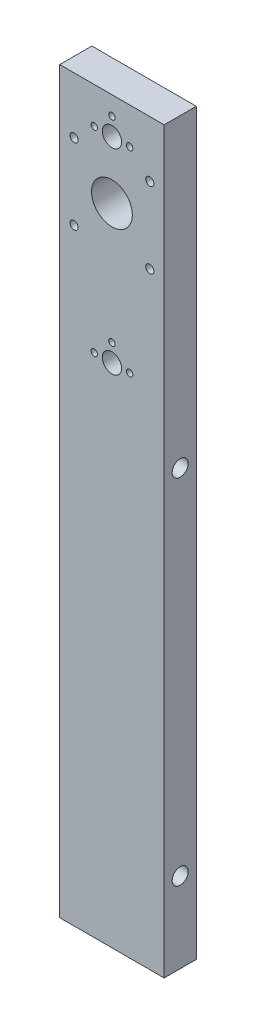
ISO-10303-21;
HEADER;
FILE_DESCRIPTION(('STEP AP214'),'2;1');
FILE_NAME('part.step','',(''),(''),'','','');
FILE_SCHEMA(('AUTOMOTIVE_DESIGN { 1 0 10303 214 1 1 1 1 }'));
ENDSEC;
DATA;
#1=APPLICATION_CONTEXT('core data for automotive mechanical design processes');
#2=APPLICATION_PROTOCOL_DEFINITION('international standard','automotive_design',2000,#1);
#3=PRODUCT_CONTEXT('',#1,'mechanical');
#4=PRODUCT('Part','Part','',(#3));
#5=PRODUCT_RELATED_PRODUCT_CATEGORY('part','',(#4));
#6=PRODUCT_DEFINITION_FORMATION('','',#4);
#7=PRODUCT_DEFINITION_CONTEXT('part definition',#1,'design');
#8=PRODUCT_DEFINITION('design','',#6,#7);
#9=PRODUCT_DEFINITION_SHAPE('','',#8);
#10=(LENGTH_UNIT() NAMED_UNIT(*) SI_UNIT(.MILLI.,.METRE.));
#11=(NAMED_UNIT(*) PLANE_ANGLE_UNIT() SI_UNIT($,.RADIAN.));
#12=(NAMED_UNIT(*) SI_UNIT($,.STERADIAN.) SOLID_ANGLE_UNIT());
#13=UNCERTAINTY_MEASURE_WITH_UNIT(LENGTH_MEASURE(1.E-05),#10,'distance_accuracy_value','');
#14=(GEOMETRIC_REPRESENTATION_CONTEXT(3) GLOBAL_UNCERTAINTY_ASSIGNED_CONTEXT((#13)) GLOBAL_UNIT_ASSIGNED_CONTEXT((#10,
#11,#12)) REPRESENTATION_CONTEXT('',''));
#15=CARTESIAN_POINT('',(0.,0.,0.));
#16=DIRECTION('',(0.,0.,1.));
#17=DIRECTION('',(1.,0.,0.));
#18=AXIS2_PLACEMENT_3D('',#15,#16,#17);
#19=CARTESIAN_POINT('',(-32.5,38.575,20.));
#20=DIRECTION('',(0.,0.,-1.));
#21=DIRECTION('',(-1.,0.,0.));
#22=AXIS2_PLACEMENT_3D('',#19,#20,#21);
#23=PLANE('',#22);
#24=CARTESIAN_POINT('',(-4.25960723338862E-13,27.,20.));
#25=DIRECTION('',(0.,0.,1.));
#26=DIRECTION('',(1.,0.,0.));
#27=AXIS2_PLACEMENT_3D('',#24,#25,#26);
#28=CIRCLE('',#27,2.);
#29=CARTESIAN_POINT('',(1.99999999999957,27.,20.));
#30=VERTEX_POINT('',#29);
#31=EDGE_CURVE('E129',#30,#30,#28,.T.);
#32=ORIENTED_EDGE('',*,*,#31,.F.);
#33=EDGE_LOOP('',(#32));
#34=FACE_BOUND('',#33,.T.);
#35=CARTESIAN_POINT('',(-11.,-106.,20.));
#36=DIRECTION('',(0.,0.,1.));
#37=DIRECTION('',(1.,0.,0.));
#38=AXIS2_PLACEMENT_3D('',#35,#36,#37);
#39=CIRCLE('',#38,2.);
#40=CARTESIAN_POINT('',(-9.,-106.,20.));
#41=VERTEX_POINT('',#40);
#42=EDGE_CURVE('E141',#41,#41,#39,.T.);
#43=ORIENTED_EDGE('',*,*,#42,.F.);
#44=EDGE_LOOP('',(#43));
#45=FACE_BOUND('',#44,.T.);
#46=CARTESIAN_POINT('',(-4.25960723338862E-13,16.,20.));
#47=DIRECTION('',(0.,0.,1.));
#48=DIRECTION('',(1.,0.,0.));
#49=AXIS2_PLACEMENT_3D('',#46,#47,#48);
#50=CIRCLE('',#49,6.);
#51=CARTESIAN_POINT('',(5.99999999999958,16.,20.));
#52=VERTEX_POINT('',#51);
#53=EDGE_CURVE('E153',#52,#52,#50,.T.);
#54=ORIENTED_EDGE('',*,*,#53,.F.);
#55=EDGE_LOOP('',(#54));
#56=FACE_BOUND('',#55,.T.);
#57=CARTESIAN_POINT('',(0.,-106.,20.));
#58=DIRECTION('',(0.,0.,1.));
#59=DIRECTION('',(1.,0.,0.));
#60=AXIS2_PLACEMENT_3D('',#57,#58,#59);
#61=CIRCLE('',#60,6.);
#62=CARTESIAN_POINT('',(6.,-106.,20.));
#63=VERTEX_POINT('',#62);
#64=EDGE_CURVE('E165',#63,#63,#61,.T.);
#65=ORIENTED_EDGE('',*,*,#64,.F.);
#66=EDGE_LOOP('',(#65));
#67=FACE_BOUND('',#66,.T.);
#68=CARTESIAN_POINT('',(-23.5712,-43.5712,20.));
#69=DIRECTION('',(0.,0.,1.));
#70=DIRECTION('',(1.,0.,0.));
#71=AXIS2_PLACEMENT_3D('',#68,#69,#70);
#72=CIRCLE('',#71,2.54);
#73=CARTESIAN_POINT('',(-21.0312,-43.5712,20.));
#74=VERTEX_POINT('',#73);
#75=EDGE_CURVE('E177',#74,#74,#72,.T.);
#76=ORIENTED_EDGE('',*,*,#75,.F.);
#77=EDGE_LOOP('',(#76));
#78=FACE_BOUND('',#77,.T.);
#79=CARTESIAN_POINT('',(23.5712,3.57119999999999,20.));
#80=DIRECTION('',(0.,0.,1.));
#81=DIRECTION('',(1.,0.,0.));
#82=AXIS2_PLACEMENT_3D('',#79,#80,#81);
#83=CIRCLE('',#82,2.54);
#84=CARTESIAN_POINT('',(26.1112,3.57119999999999,20.));
#85=VERTEX_POINT('',#84);
#86=EDGE_CURVE('E189',#85,#85,#83,.T.);
#87=ORIENTED_EDGE('',*,*,#86,.F.);
#88=EDGE_LOOP('',(#87));
#89=FACE_BOUND('',#88,.T.);
#90=DIRECTION('',(0.,-1.,0.));
#91=VECTOR('',#90,1.);
#92=CARTESIAN_POINT('',(-32.5,-421.425,20.));
#93=LINE('',#92,#91);
#94=CARTESIAN_POINT('',(-32.5,38.575,20.));
#95=VERTEX_POINT('',#94);
#96=CARTESIAN_POINT('',(-32.5,-421.425,20.));
#97=VERTEX_POINT('',#96);
#98=EDGE_CURVE('E87',#95,#97,#93,.T.);
#99=ORIENTED_EDGE('',*,*,#98,.T.);
#100=DIRECTION('',(1.,0.,0.));
#101=VECTOR('',#100,1.);
#102=CARTESIAN_POINT('',(-32.5,-421.425,20.));
#103=LINE('',#102,#101);
#104=CARTESIAN_POINT('',(32.5,-421.425,20.));
#105=VERTEX_POINT('',#104);
#106=EDGE_CURVE('E82',#97,#105,#103,.T.);
#107=ORIENTED_EDGE('',*,*,#106,.T.);
#108=DIRECTION('',(0.,1.,0.));
#109=VECTOR('',#108,1.);
#110=CARTESIAN_POINT('',(32.5,-421.425,20.));
#111=LINE('',#110,#109);
#112=CARTESIAN_POINT('',(32.5,38.575,20.));
#113=VERTEX_POINT('',#112);
#114=EDGE_CURVE('E85',#105,#113,#111,.T.);
#115=ORIENTED_EDGE('',*,*,#114,.T.);
#116=DIRECTION('',(-1.,0.,0.));
#117=VECTOR('',#116,1.);
#118=CARTESIAN_POINT('',(-32.5,38.575,20.));
#119=LINE('',#118,#117);
#120=EDGE_CURVE('E52',#113,#95,#119,.T.);
#121=ORIENTED_EDGE('',*,*,#120,.T.);
#122=EDGE_LOOP('',(#99,#107,#115,#121));
#123=FACE_BOUND('',#122,.T.);
#124=CARTESIAN_POINT('',(-23.5712,3.57119999999998,20.));
#125=DIRECTION('',(0.,0.,1.));
#126=DIRECTION('',(1.,0.,0.));
#127=AXIS2_PLACEMENT_3D('',#124,#125,#126);
#128=CIRCLE('',#127,2.54);
#129=CARTESIAN_POINT('',(-21.0312,3.57119999999998,20.));
#130=VERTEX_POINT('',#129);
#131=EDGE_CURVE('E103',#130,#130,#128,.T.);
#132=ORIENTED_EDGE('',*,*,#131,.F.);
#133=EDGE_LOOP('',(#132));
#134=FACE_BOUND('',#133,.T.);
#135=CARTESIAN_POINT('',(23.5712,-43.5712,20.));
#136=DIRECTION('',(0.,0.,1.));
#137=DIRECTION('',(1.,0.,0.));
#138=AXIS2_PLACEMENT_3D('',#135,#136,#137);
#139=CIRCLE('',#138,2.54);
#140=CARTESIAN_POINT('',(26.1112,-43.5712,20.));
#141=VERTEX_POINT('',#140);
#142=EDGE_CURVE('E183',#141,#141,#139,.T.);
#143=ORIENTED_EDGE('',*,*,#142,.F.);
#144=EDGE_LOOP('',(#143));
#145=FACE_BOUND('',#144,.T.);
#146=CARTESIAN_POINT('',(0.,-20.,20.));
#147=DIRECTION('',(0.,0.,1.));
#148=DIRECTION('',(1.,0.,0.));
#149=AXIS2_PLACEMENT_3D('',#146,#147,#148);
#150=CIRCLE('',#149,12.7);
#151=CARTESIAN_POINT('',(12.7,-20.,20.));
#152=VERTEX_POINT('',#151);
#153=EDGE_CURVE('E171',#152,#152,#150,.T.);
#154=ORIENTED_EDGE('',*,*,#153,.F.);
#155=EDGE_LOOP('',(#154));
#156=FACE_BOUND('',#155,.T.);
#157=CARTESIAN_POINT('',(11.,-106.,20.));
#158=DIRECTION('',(0.,0.,1.));
#159=DIRECTION('',(1.,0.,0.));
#160=AXIS2_PLACEMENT_3D('',#157,#158,#159);
#161=CIRCLE('',#160,2.);
#162=CARTESIAN_POINT('',(13.,-106.,20.));
#163=VERTEX_POINT('',#162);
#164=EDGE_CURVE('E159',#163,#163,#161,.T.);
#165=ORIENTED_EDGE('',*,*,#164,.F.);
#166=EDGE_LOOP('',(#165));
#167=FACE_BOUND('',#166,.T.);
#168=CARTESIAN_POINT('',(0.,-95.,20.));
#169=DIRECTION('',(0.,0.,1.));
#170=DIRECTION('',(1.,0.,0.));
#171=AXIS2_PLACEMENT_3D('',#168,#169,#170);
#172=CIRCLE('',#171,2.);
#173=CARTESIAN_POINT('',(2.,-95.,20.));
#174=VERTEX_POINT('',#173);
#175=EDGE_CURVE('E147',#174,#174,#172,.T.);
#176=ORIENTED_EDGE('',*,*,#175,.F.);
#177=EDGE_LOOP('',(#176));
#178=FACE_BOUND('',#177,.T.);
#179=CARTESIAN_POINT('',(10.9999999999996,16.,20.));
#180=DIRECTION('',(0.,0.,1.));
#181=DIRECTION('',(1.,0.,0.));
#182=AXIS2_PLACEMENT_3D('',#179,#180,#181);
#183=CIRCLE('',#182,2.);
#184=CARTESIAN_POINT('',(12.9999999999996,16.,20.));
#185=VERTEX_POINT('',#184);
#186=EDGE_CURVE('E135',#185,#185,#183,.T.);
#187=ORIENTED_EDGE('',*,*,#186,.F.);
#188=EDGE_LOOP('',(#187));
#189=FACE_BOUND('',#188,.T.);
#190=CARTESIAN_POINT('',(-11.0000000000004,16.,20.));
#191=DIRECTION('',(0.,0.,1.));
#192=DIRECTION('',(1.,0.,0.));
#193=AXIS2_PLACEMENT_3D('',#190,#191,#192);
#194=CIRCLE('',#193,2.);
#195=CARTESIAN_POINT('',(-9.00000000000042,16.,20.));
#196=VERTEX_POINT('',#195);
#197=EDGE_CURVE('E123',#196,#196,#194,.T.);
#198=ORIENTED_EDGE('',*,*,#197,.F.);
#199=EDGE_LOOP('',(#198));
#200=FACE_BOUND('',#199,.T.);
#201=ADVANCED_FACE('F33',(#34,#45,#56,#67,#78,#89,#123,#134,#145,#156,#167,#178,#189,#200),#23,.F.);
#202=CARTESIAN_POINT('',(-32.5,38.575,0.));
#203=DIRECTION('',(0.,0.,-1.));
#204=DIRECTION('',(-1.,0.,0.));
#205=AXIS2_PLACEMENT_3D('',#202,#203,#204);
#206=PLANE('',#205);
#207=CARTESIAN_POINT('',(-4.25960723338862E-13,27.,0.));
#208=DIRECTION('',(0.,0.,1.));
#209=DIRECTION('',(1.,0.,0.));
#210=AXIS2_PLACEMENT_3D('',#207,#208,#209);
#211=CIRCLE('',#210,2.);
#212=CARTESIAN_POINT('',(1.99999999999957,27.,0.));
#213=VERTEX_POINT('',#212);
#214=EDGE_CURVE('E126',#213,#213,#211,.T.);
#215=ORIENTED_EDGE('',*,*,#214,.T.);
#216=EDGE_LOOP('',(#215));
#217=FACE_BOUND('',#216,.T.);
#218=CARTESIAN_POINT('',(-11.,-106.,0.));
#219=DIRECTION('',(0.,0.,1.));
#220=DIRECTION('',(1.,0.,0.));
#221=AXIS2_PLACEMENT_3D('',#218,#219,#220);
#222=CIRCLE('',#221,2.);
#223=CARTESIAN_POINT('',(-9.,-106.,0.));
#224=VERTEX_POINT('',#223);
#225=EDGE_CURVE('E138',#224,#224,#222,.T.);
#226=ORIENTED_EDGE('',*,*,#225,.T.);
#227=EDGE_LOOP('',(#226));
#228=FACE_BOUND('',#227,.T.);
#229=CARTESIAN_POINT('',(-4.25960723338862E-13,16.,0.));
#230=DIRECTION('',(0.,0.,1.));
#231=DIRECTION('',(1.,0.,0.));
#232=AXIS2_PLACEMENT_3D('',#229,#230,#231);
#233=CIRCLE('',#232,6.);
#234=CARTESIAN_POINT('',(5.99999999999958,16.,0.));
#235=VERTEX_POINT('',#234);
#236=EDGE_CURVE('E150',#235,#235,#233,.T.);
#237=ORIENTED_EDGE('',*,*,#236,.T.);
#238=EDGE_LOOP('',(#237));
#239=FACE_BOUND('',#238,.T.);
#240=CARTESIAN_POINT('',(0.,-106.,0.));
#241=DIRECTION('',(0.,0.,1.));
#242=DIRECTION('',(1.,0.,0.));
#243=AXIS2_PLACEMENT_3D('',#240,#241,#242);
#244=CIRCLE('',#243,6.);
#245=CARTESIAN_POINT('',(6.,-106.,0.));
#246=VERTEX_POINT('',#245);
#247=EDGE_CURVE('E162',#246,#246,#244,.T.);
#248=ORIENTED_EDGE('',*,*,#247,.T.);
#249=EDGE_LOOP('',(#248));
#250=FACE_BOUND('',#249,.T.);
#251=CARTESIAN_POINT('',(-23.5712,-43.5712,0.));
#252=DIRECTION('',(0.,0.,1.));
#253=DIRECTION('',(1.,0.,0.));
#254=AXIS2_PLACEMENT_3D('',#251,#252,#253);
#255=CIRCLE('',#254,2.54);
#256=CARTESIAN_POINT('',(-21.0312,-43.5712,0.));
#257=VERTEX_POINT('',#256);
#258=EDGE_CURVE('E174',#257,#257,#255,.T.);
#259=ORIENTED_EDGE('',*,*,#258,.T.);
#260=EDGE_LOOP('',(#259));
#261=FACE_BOUND('',#260,.T.);
#262=CARTESIAN_POINT('',(23.5712,3.57119999999999,0.));
#263=DIRECTION('',(0.,0.,1.));
#264=DIRECTION('',(1.,0.,0.));
#265=AXIS2_PLACEMENT_3D('',#262,#263,#264);
#266=CIRCLE('',#265,2.54);
#267=CARTESIAN_POINT('',(26.1112,3.57119999999999,0.));
#268=VERTEX_POINT('',#267);
#269=EDGE_CURVE('E186',#268,#268,#266,.T.);
#270=ORIENTED_EDGE('',*,*,#269,.T.);
#271=EDGE_LOOP('',(#270));
#272=FACE_BOUND('',#271,.T.);
#273=DIRECTION('',(0.,-1.,0.));
#274=VECTOR('',#273,1.);
#275=CARTESIAN_POINT('',(-32.5,-421.425,0.));
#276=LINE('',#275,#274);
#277=CARTESIAN_POINT('',(-32.5,38.575,0.));
#278=VERTEX_POINT('',#277);
#279=CARTESIAN_POINT('',(-32.5,-421.425,0.));
#280=VERTEX_POINT('',#279);
#281=EDGE_CURVE('E100',#278,#280,#276,.T.);
#282=ORIENTED_EDGE('',*,*,#281,.F.);
#283=DIRECTION('',(-1.,0.,0.));
#284=VECTOR('',#283,1.);
#285=CARTESIAN_POINT('',(-32.5,38.575,0.));
#286=LINE('',#285,#284);
#287=CARTESIAN_POINT('',(32.5,38.575,0.));
#288=VERTEX_POINT('',#287);
#289=EDGE_CURVE('E75',#288,#278,#286,.T.);
#290=ORIENTED_EDGE('',*,*,#289,.F.);
#291=DIRECTION('',(0.,1.,0.));
#292=VECTOR('',#291,1.);
#293=CARTESIAN_POINT('',(32.5,-421.425,0.));
#294=LINE('',#293,#292);
#295=CARTESIAN_POINT('',(32.5,-421.425,0.));
#296=VERTEX_POINT('',#295);
#297=EDGE_CURVE('E69',#296,#288,#294,.T.);
#298=ORIENTED_EDGE('',*,*,#297,.F.);
#299=DIRECTION('',(1.,0.,0.));
#300=VECTOR('',#299,1.);
#301=CARTESIAN_POINT('',(-32.5,-421.425,0.));
#302=LINE('',#301,#300);
#303=EDGE_CURVE('E91',#280,#296,#302,.T.);
#304=ORIENTED_EDGE('',*,*,#303,.F.);
#305=EDGE_LOOP('',(#282,#290,#298,#304));
#306=FACE_BOUND('',#305,.T.);
#307=CARTESIAN_POINT('',(-23.5712,3.57119999999998,0.));
#308=DIRECTION('',(0.,0.,1.));
#309=DIRECTION('',(1.,0.,0.));
#310=AXIS2_PLACEMENT_3D('',#307,#308,#309);
#311=CIRCLE('',#310,2.54);
#312=CARTESIAN_POINT('',(-21.0312,3.57119999999998,0.));
#313=VERTEX_POINT('',#312);
#314=EDGE_CURVE('E192',#313,#313,#311,.T.);
#315=ORIENTED_EDGE('',*,*,#314,.T.);
#316=EDGE_LOOP('',(#315));
#317=FACE_BOUND('',#316,.T.);
#318=CARTESIAN_POINT('',(23.5712,-43.5712,0.));
#319=DIRECTION('',(0.,0.,1.));
#320=DIRECTION('',(1.,0.,0.));
#321=AXIS2_PLACEMENT_3D('',#318,#319,#320);
#322=CIRCLE('',#321,2.54);
#323=CARTESIAN_POINT('',(26.1112,-43.5712,0.));
#324=VERTEX_POINT('',#323);
#325=EDGE_CURVE('E180',#324,#324,#322,.T.);
#326=ORIENTED_EDGE('',*,*,#325,.T.);
#327=EDGE_LOOP('',(#326));
#328=FACE_BOUND('',#327,.T.);
#329=CARTESIAN_POINT('',(0.,-20.,0.));
#330=DIRECTION('',(0.,0.,1.));
#331=DIRECTION('',(1.,0.,0.));
#332=AXIS2_PLACEMENT_3D('',#329,#330,#331);
#333=CIRCLE('',#332,12.7);
#334=CARTESIAN_POINT('',(12.7,-20.,0.));
#335=VERTEX_POINT('',#334);
#336=EDGE_CURVE('E168',#335,#335,#333,.T.);
#337=ORIENTED_EDGE('',*,*,#336,.T.);
#338=EDGE_LOOP('',(#337));
#339=FACE_BOUND('',#338,.T.);
#340=CARTESIAN_POINT('',(11.,-106.,0.));
#341=DIRECTION('',(0.,0.,1.));
#342=DIRECTION('',(1.,0.,0.));
#343=AXIS2_PLACEMENT_3D('',#340,#341,#342);
#344=CIRCLE('',#343,2.);
#345=CARTESIAN_POINT('',(13.,-106.,0.));
#346=VERTEX_POINT('',#345);
#347=EDGE_CURVE('E156',#346,#346,#344,.T.);
#348=ORIENTED_EDGE('',*,*,#347,.T.);
#349=EDGE_LOOP('',(#348));
#350=FACE_BOUND('',#349,.T.);
#351=CARTESIAN_POINT('',(0.,-95.,0.));
#352=DIRECTION('',(0.,0.,1.));
#353=DIRECTION('',(1.,0.,0.));
#354=AXIS2_PLACEMENT_3D('',#351,#352,#353);
#355=CIRCLE('',#354,2.);
#356=CARTESIAN_POINT('',(2.,-95.,0.));
#357=VERTEX_POINT('',#356);
#358=EDGE_CURVE('E144',#357,#357,#355,.T.);
#359=ORIENTED_EDGE('',*,*,#358,.T.);
#360=EDGE_LOOP('',(#359));
#361=FACE_BOUND('',#360,.T.);
#362=CARTESIAN_POINT('',(10.9999999999996,16.,0.));
#363=DIRECTION('',(0.,0.,1.));
#364=DIRECTION('',(1.,0.,0.));
#365=AXIS2_PLACEMENT_3D('',#362,#363,#364);
#366=CIRCLE('',#365,2.);
#367=CARTESIAN_POINT('',(12.9999999999996,16.,0.));
#368=VERTEX_POINT('',#367);
#369=EDGE_CURVE('E132',#368,#368,#366,.T.);
#370=ORIENTED_EDGE('',*,*,#369,.T.);
#371=EDGE_LOOP('',(#370));
#372=FACE_BOUND('',#371,.T.);
#373=CARTESIAN_POINT('',(-11.0000000000004,16.,0.));
#374=DIRECTION('',(0.,0.,1.));
#375=DIRECTION('',(1.,0.,0.));
#376=AXIS2_PLACEMENT_3D('',#373,#374,#375);
#377=CIRCLE('',#376,2.);
#378=CARTESIAN_POINT('',(-9.00000000000042,16.,0.));
#379=VERTEX_POINT('',#378);
#380=EDGE_CURVE('E115',#379,#379,#377,.T.);
#381=ORIENTED_EDGE('',*,*,#380,.T.);
#382=EDGE_LOOP('',(#381));
#383=FACE_BOUND('',#382,.T.);
#384=ADVANCED_FACE('F200',(#217,#228,#239,#250,#261,#272,#306,#317,#328,#339,#350,#361,#372,
#383),#206,.T.);
#385=CARTESIAN_POINT('',(-32.5,-421.425,20.));
#386=DIRECTION('',(1.,0.,0.));
#387=DIRECTION('',(0.,1.,0.));
#388=AXIS2_PLACEMENT_3D('',#385,#386,#387);
#389=PLANE('',#388);
#390=CARTESIAN_POINT('',(-32.5,-151.425,10.));
#391=DIRECTION('',(1.,0.,0.));
#392=DIRECTION('',(0.,1.,0.));
#393=AXIS2_PLACEMENT_3D('',#390,#391,#392);
#394=CIRCLE('',#393,5.);
#395=CARTESIAN_POINT('',(-32.5,-146.425,10.));
#396=VERTEX_POINT('',#395);
#397=EDGE_CURVE('E111',#396,#396,#394,.T.);
#398=ORIENTED_EDGE('',*,*,#397,.T.);
#399=EDGE_LOOP('',(#398));
#400=FACE_BOUND('',#399,.T.);
#401=CARTESIAN_POINT('',(-32.5,-371.425,10.));
#402=DIRECTION('',(1.,0.,0.));
#403=DIRECTION('',(0.,1.,0.));
#404=AXIS2_PLACEMENT_3D('',#401,#402,#403);
#405=CIRCLE('',#404,5.);
#406=CARTESIAN_POINT('',(-32.5,-366.425,10.));
#407=VERTEX_POINT('',#406);
#408=EDGE_CURVE('E110',#407,#407,#405,.T.);
#409=ORIENTED_EDGE('',*,*,#408,.T.);
#410=EDGE_LOOP('',(#409));
#411=FACE_BOUND('',#410,.T.);
#412=ORIENTED_EDGE('',*,*,#281,.T.);
#413=DIRECTION('',(0.,0.,-1.));
#414=VECTOR('',#413,1.);
#415=CARTESIAN_POINT('',(-32.5,-421.425,20.));
#416=LINE('',#415,#414);
#417=EDGE_CURVE('E11',#97,#280,#416,.T.);
#418=ORIENTED_EDGE('',*,*,#417,.F.);
#419=ORIENTED_EDGE('',*,*,#98,.F.);
#420=DIRECTION('',(0.,0.,-1.));
#421=VECTOR('',#420,1.);
#422=CARTESIAN_POINT('',(-32.5,38.575,20.));
#423=LINE('',#422,#421);
#424=EDGE_CURVE('E96',#95,#278,#423,.T.);
#425=ORIENTED_EDGE('',*,*,#424,.T.);
#426=EDGE_LOOP('',(#412,#418,#419,#425));
#427=FACE_BOUND('',#426,.T.);
#428=ADVANCED_FACE('F35',(#400,#411,#427),#389,.F.);
#429=CARTESIAN_POINT('',(-32.5,-421.425,20.));
#430=DIRECTION('',(0.,1.,0.));
#431=DIRECTION('',(0.,0.,1.));
#432=AXIS2_PLACEMENT_3D('',#429,#430,#431);
#433=PLANE('',#432);
#434=ORIENTED_EDGE('',*,*,#303,.T.);
#435=DIRECTION('',(0.,0.,-1.));
#436=VECTOR('',#435,1.);
#437=CARTESIAN_POINT('',(32.5,-421.425,20.));
#438=LINE('',#437,#436);
#439=EDGE_CURVE('E43',#105,#296,#438,.T.);
#440=ORIENTED_EDGE('',*,*,#439,.F.);
#441=ORIENTED_EDGE('',*,*,#106,.F.);
#442=ORIENTED_EDGE('',*,*,#417,.T.);
#443=EDGE_LOOP('',(#434,#440,#441,#442));
#444=FACE_BOUND('',#443,.T.);
#445=ADVANCED_FACE('F90',(#444),#433,.F.);
#446=CARTESIAN_POINT('',(32.5,-421.425,20.));
#447=DIRECTION('',(-1.,0.,0.));
#448=DIRECTION('',(0.,0.,1.));
#449=AXIS2_PLACEMENT_3D('',#446,#447,#448);
#450=PLANE('',#449);
#451=CARTESIAN_POINT('',(32.5,-151.425,10.));
#452=DIRECTION('',(-1.,0.,0.));
#453=DIRECTION('',(0.,0.,1.));
#454=AXIS2_PLACEMENT_3D('',#451,#452,#453);
#455=CIRCLE('',#454,5.);
#456=CARTESIAN_POINT('',(32.5,-151.425,15.));
#457=VERTEX_POINT('',#456);
#458=EDGE_CURVE('E37',#457,#457,#455,.T.);
#459=ORIENTED_EDGE('',*,*,#458,.T.);
#460=EDGE_LOOP('',(#459));
#461=FACE_BOUND('',#460,.T.);
#462=CARTESIAN_POINT('',(32.5,-371.425,10.));
#463=DIRECTION('',(-1.,0.,0.));
#464=DIRECTION('',(0.,0.,1.));
#465=AXIS2_PLACEMENT_3D('',#462,#463,#464);
#466=CIRCLE('',#465,5.);
#467=CARTESIAN_POINT('',(32.5,-371.425,15.));
#468=VERTEX_POINT('',#467);
#469=EDGE_CURVE('E108',#468,#468,#466,.T.);
#470=ORIENTED_EDGE('',*,*,#469,.T.);
#471=EDGE_LOOP('',(#470));
#472=FACE_BOUND('',#471,.T.);
#473=ORIENTED_EDGE('',*,*,#297,.T.);
#474=DIRECTION('',(0.,0.,-1.));
#475=VECTOR('',#474,1.);
#476=CARTESIAN_POINT('',(32.5,38.575,20.));
#477=LINE('',#476,#475);
#478=EDGE_CURVE('E92',#113,#288,#477,.T.);
#479=ORIENTED_EDGE('',*,*,#478,.F.);
#480=ORIENTED_EDGE('',*,*,#114,.F.);
#481=ORIENTED_EDGE('',*,*,#439,.T.);
#482=EDGE_LOOP('',(#473,#479,#480,#481));
#483=FACE_BOUND('',#482,.T.);
#484=ADVANCED_FACE('F94',(#461,#472,#483),#450,.F.);
#485=CARTESIAN_POINT('',(-32.5,38.575,20.));
#486=DIRECTION('',(0.,-1.,0.));
#487=DIRECTION('',(0.,0.,-1.));
#488=AXIS2_PLACEMENT_3D('',#485,#486,#487);
#489=PLANE('',#488);
#490=ORIENTED_EDGE('',*,*,#289,.T.);
#491=ORIENTED_EDGE('',*,*,#424,.F.);
#492=ORIENTED_EDGE('',*,*,#120,.F.);
#493=ORIENTED_EDGE('',*,*,#478,.T.);
#494=EDGE_LOOP('',(#490,#491,#492,#493));
#495=FACE_BOUND('',#494,.T.);
#496=ADVANCED_FACE('F206',(#495),#489,.F.);
#497=CARTESIAN_POINT('',(-23.5712,3.57119999999998,20.));
#498=DIRECTION('',(0.,0.,-1.));
#499=DIRECTION('',(-1.,0.,0.));
#500=AXIS2_PLACEMENT_3D('',#497,#498,#499);
#501=CYLINDRICAL_SURFACE('',#500,2.54);
#502=ORIENTED_EDGE('',*,*,#131,.T.);
#503=EDGE_LOOP('',(#502));
#504=FACE_BOUND('',#503,.T.);
#505=ORIENTED_EDGE('',*,*,#314,.F.);
#506=EDGE_LOOP('',(#505));
#507=FACE_BOUND('',#506,.T.);
#508=ADVANCED_FACE('F203',(#504,#507),#501,.F.);
#509=CARTESIAN_POINT('',(23.5712,3.57119999999999,20.));
#510=DIRECTION('',(0.,0.,-1.));
#511=DIRECTION('',(-1.,0.,0.));
#512=AXIS2_PLACEMENT_3D('',#509,#510,#511);
#513=CYLINDRICAL_SURFACE('',#512,2.54);
#514=ORIENTED_EDGE('',*,*,#86,.T.);
#515=EDGE_LOOP('',(#514));
#516=FACE_BOUND('',#515,.T.);
#517=ORIENTED_EDGE('',*,*,#269,.F.);
#518=EDGE_LOOP('',(#517));
#519=FACE_BOUND('',#518,.T.);
#520=ADVANCED_FACE('F205',(#516,#519),#513,.F.);
#521=CARTESIAN_POINT('',(23.5712,-43.5712,20.));
#522=DIRECTION('',(0.,0.,-1.));
#523=DIRECTION('',(-1.,0.,0.));
#524=AXIS2_PLACEMENT_3D('',#521,#522,#523);
#525=CYLINDRICAL_SURFACE('',#524,2.54);
#526=ORIENTED_EDGE('',*,*,#142,.T.);
#527=EDGE_LOOP('',(#526));
#528=FACE_BOUND('',#527,.T.);
#529=ORIENTED_EDGE('',*,*,#325,.F.);
#530=EDGE_LOOP('',(#529));
#531=FACE_BOUND('',#530,.T.);
#532=ADVANCED_FACE('F213',(#528,#531),#525,.F.);
#533=CARTESIAN_POINT('',(-23.5712,-43.5712,20.));
#534=DIRECTION('',(0.,0.,-1.));
#535=DIRECTION('',(-1.,0.,0.));
#536=AXIS2_PLACEMENT_3D('',#533,#534,#535);
#537=CYLINDRICAL_SURFACE('',#536,2.54);
#538=ORIENTED_EDGE('',*,*,#75,.T.);
#539=EDGE_LOOP('',(#538));
#540=FACE_BOUND('',#539,.T.);
#541=ORIENTED_EDGE('',*,*,#258,.F.);
#542=EDGE_LOOP('',(#541));
#543=FACE_BOUND('',#542,.T.);
#544=ADVANCED_FACE('F288',(#540,#543),#537,.F.);
#545=CARTESIAN_POINT('',(0.,-20.,20.));
#546=DIRECTION('',(0.,0.,-1.));
#547=DIRECTION('',(-1.,0.,0.));
#548=AXIS2_PLACEMENT_3D('',#545,#546,#547);
#549=CYLINDRICAL_SURFACE('',#548,12.7);
#550=ORIENTED_EDGE('',*,*,#153,.T.);
#551=EDGE_LOOP('',(#550));
#552=FACE_BOUND('',#551,.T.);
#553=ORIENTED_EDGE('',*,*,#336,.F.);
#554=EDGE_LOOP('',(#553));
#555=FACE_BOUND('',#554,.T.);
#556=ADVANCED_FACE('F284',(#552,#555),#549,.F.);
#557=CARTESIAN_POINT('',(0.,-106.,20.));
#558=DIRECTION('',(0.,0.,-1.));
#559=DIRECTION('',(-1.,0.,0.));
#560=AXIS2_PLACEMENT_3D('',#557,#558,#559);
#561=CYLINDRICAL_SURFACE('',#560,6.);
#562=ORIENTED_EDGE('',*,*,#64,.T.);
#563=EDGE_LOOP('',(#562));
#564=FACE_BOUND('',#563,.T.);
#565=ORIENTED_EDGE('',*,*,#247,.F.);
#566=EDGE_LOOP('',(#565));
#567=FACE_BOUND('',#566,.T.);
#568=ADVANCED_FACE('F280',(#564,#567),#561,.F.);
#569=CARTESIAN_POINT('',(11.,-106.,20.));
#570=DIRECTION('',(0.,0.,-1.));
#571=DIRECTION('',(-1.,0.,0.));
#572=AXIS2_PLACEMENT_3D('',#569,#570,#571);
#573=CYLINDRICAL_SURFACE('',#572,2.);
#574=ORIENTED_EDGE('',*,*,#164,.T.);
#575=EDGE_LOOP('',(#574));
#576=FACE_BOUND('',#575,.T.);
#577=ORIENTED_EDGE('',*,*,#347,.F.);
#578=EDGE_LOOP('',(#577));
#579=FACE_BOUND('',#578,.T.);
#580=ADVANCED_FACE('F276',(#576,#579),#573,.F.);
#581=CARTESIAN_POINT('',(-4.25960723338862E-13,16.,20.));
#582=DIRECTION('',(0.,0.,-1.));
#583=DIRECTION('',(-1.,0.,0.));
#584=AXIS2_PLACEMENT_3D('',#581,#582,#583);
#585=CYLINDRICAL_SURFACE('',#584,6.);
#586=ORIENTED_EDGE('',*,*,#53,.T.);
#587=EDGE_LOOP('',(#586));
#588=FACE_BOUND('',#587,.T.);
#589=ORIENTED_EDGE('',*,*,#236,.F.);
#590=EDGE_LOOP('',(#589));
#591=FACE_BOUND('',#590,.T.);
#592=ADVANCED_FACE('F272',(#588,#591),#585,.F.);
#593=CARTESIAN_POINT('',(0.,-95.,20.));
#594=DIRECTION('',(0.,0.,-1.));
#595=DIRECTION('',(-1.,0.,0.));
#596=AXIS2_PLACEMENT_3D('',#593,#594,#595);
#597=CYLINDRICAL_SURFACE('',#596,2.);
#598=ORIENTED_EDGE('',*,*,#175,.T.);
#599=EDGE_LOOP('',(#598));
#600=FACE_BOUND('',#599,.T.);
#601=ORIENTED_EDGE('',*,*,#358,.F.);
#602=EDGE_LOOP('',(#601));
#603=FACE_BOUND('',#602,.T.);
#604=ADVANCED_FACE('F268',(#600,#603),#597,.F.);
#605=CARTESIAN_POINT('',(-11.,-106.,20.));
#606=DIRECTION('',(0.,0.,-1.));
#607=DIRECTION('',(-1.,0.,0.));
#608=AXIS2_PLACEMENT_3D('',#605,#606,#607);
#609=CYLINDRICAL_SURFACE('',#608,2.);
#610=ORIENTED_EDGE('',*,*,#42,.T.);
#611=EDGE_LOOP('',(#610));
#612=FACE_BOUND('',#611,.T.);
#613=ORIENTED_EDGE('',*,*,#225,.F.);
#614=EDGE_LOOP('',(#613));
#615=FACE_BOUND('',#614,.T.);
#616=ADVANCED_FACE('F264',(#612,#615),#609,.F.);
#617=CARTESIAN_POINT('',(10.9999999999996,16.,20.));
#618=DIRECTION('',(0.,0.,-1.));
#619=DIRECTION('',(-1.,0.,0.));
#620=AXIS2_PLACEMENT_3D('',#617,#618,#619);
#621=CYLINDRICAL_SURFACE('',#620,2.);
#622=ORIENTED_EDGE('',*,*,#186,.T.);
#623=EDGE_LOOP('',(#622));
#624=FACE_BOUND('',#623,.T.);
#625=ORIENTED_EDGE('',*,*,#369,.F.);
#626=EDGE_LOOP('',(#625));
#627=FACE_BOUND('',#626,.T.);
#628=ADVANCED_FACE('F260',(#624,#627),#621,.F.);
#629=CARTESIAN_POINT('',(-4.25960723338862E-13,27.,20.));
#630=DIRECTION('',(0.,0.,-1.));
#631=DIRECTION('',(-1.,0.,0.));
#632=AXIS2_PLACEMENT_3D('',#629,#630,#631);
#633=CYLINDRICAL_SURFACE('',#632,2.);
#634=ORIENTED_EDGE('',*,*,#31,.T.);
#635=EDGE_LOOP('',(#634));
#636=FACE_BOUND('',#635,.T.);
#637=ORIENTED_EDGE('',*,*,#214,.F.);
#638=EDGE_LOOP('',(#637));
#639=FACE_BOUND('',#638,.T.);
#640=ADVANCED_FACE('F254',(#636,#639),#633,.F.);
#641=CARTESIAN_POINT('',(-11.0000000000004,16.,20.));
#642=DIRECTION('',(0.,0.,-1.));
#643=DIRECTION('',(-1.,0.,0.));
#644=AXIS2_PLACEMENT_3D('',#641,#642,#643);
#645=CYLINDRICAL_SURFACE('',#644,2.);
#646=ORIENTED_EDGE('',*,*,#197,.T.);
#647=EDGE_LOOP('',(#646));
#648=FACE_BOUND('',#647,.T.);
#649=ORIENTED_EDGE('',*,*,#380,.F.);
#650=EDGE_LOOP('',(#649));
#651=FACE_BOUND('',#650,.T.);
#652=ADVANCED_FACE('F245',(#648,#651),#645,.F.);
#653=CARTESIAN_POINT('',(-40.,-371.425,10.));
#654=DIRECTION('',(1.,0.,0.));
#655=DIRECTION('',(0.,0.,-1.));
#656=AXIS2_PLACEMENT_3D('',#653,#654,#655);
#657=CYLINDRICAL_SURFACE('',#656,5.);
#658=ORIENTED_EDGE('',*,*,#469,.F.);
#659=EDGE_LOOP('',(#658));
#660=FACE_BOUND('',#659,.T.);
#661=ORIENTED_EDGE('',*,*,#408,.F.);
#662=EDGE_LOOP('',(#661));
#663=FACE_BOUND('',#662,.T.);
#664=ADVANCED_FACE('F242',(#660,#663),#657,.F.);
#665=CARTESIAN_POINT('',(-40.,-151.425,10.));
#666=DIRECTION('',(1.,0.,0.));
#667=DIRECTION('',(0.,0.,-1.));
#668=AXIS2_PLACEMENT_3D('',#665,#666,#667);
#669=CYLINDRICAL_SURFACE('',#668,5.);
#670=ORIENTED_EDGE('',*,*,#458,.F.);
#671=EDGE_LOOP('',(#670));
#672=FACE_BOUND('',#671,.T.);
#673=ORIENTED_EDGE('',*,*,#397,.F.);
#674=EDGE_LOOP('',(#673));
#675=FACE_BOUND('',#674,.T.);
#676=ADVANCED_FACE('F244',(#672,#675),#669,.F.);
#677=CLOSED_SHELL('',(#201,#384,#428,#445,#484,#496,#508,#520,#532,#544,#556,#568,#580,#592,
#604,#616,#628,#640,#652,#664,#676));
#678=MANIFOLD_SOLID_BREP('B2',#677);
#679=ADVANCED_BREP_SHAPE_REPRESENTATION('',(#18,#678),#14);
#680=SHAPE_DEFINITION_REPRESENTATION(#9,#679);
ENDSEC;
END-ISO-10303-21;
